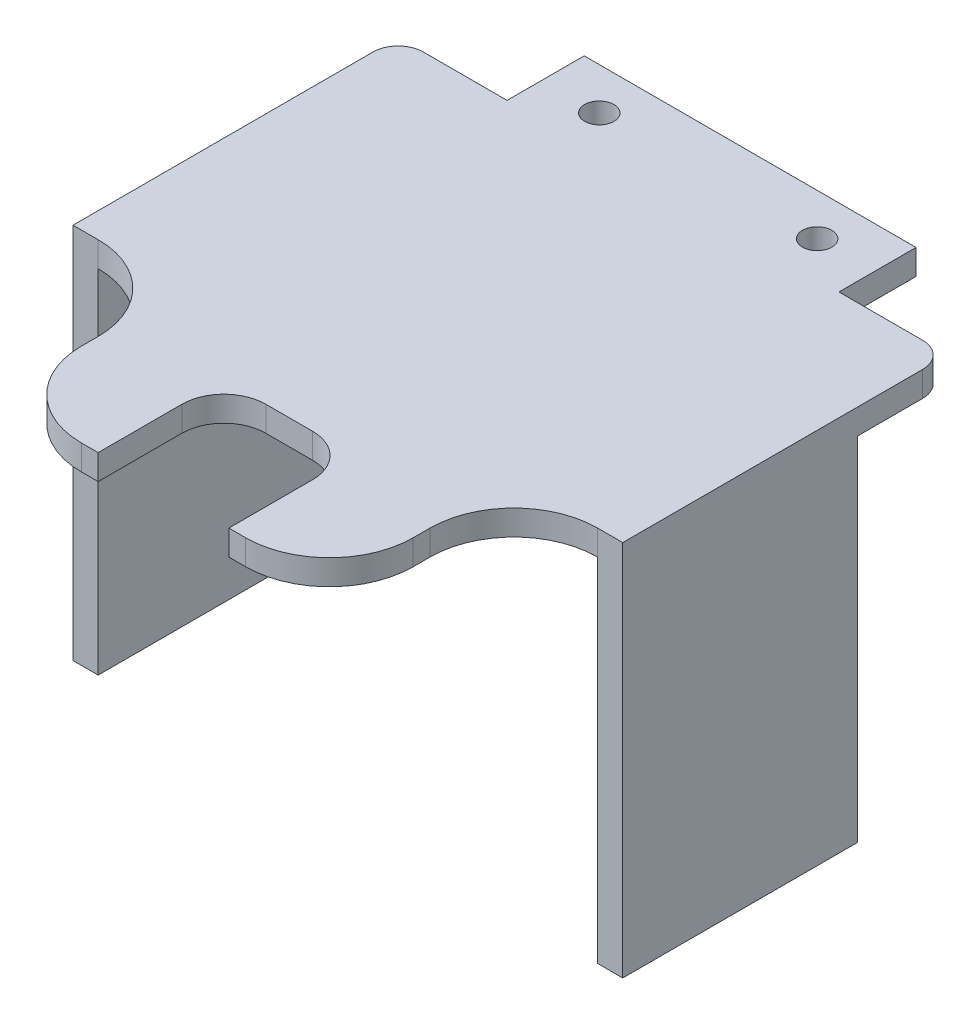
ISO-10303-21;
HEADER;
FILE_DESCRIPTION(('STEP AP214'),'2;1');
FILE_NAME('part.step','',(''),(''),'','','');
FILE_SCHEMA(('AUTOMOTIVE_DESIGN { 1 0 10303 214 1 1 1 1 }'));
ENDSEC;
DATA;
#1=APPLICATION_CONTEXT('core data for automotive mechanical design processes');
#2=APPLICATION_PROTOCOL_DEFINITION('international standard','automotive_design',2000,#1);
#3=PRODUCT_CONTEXT('',#1,'mechanical');
#4=PRODUCT('Part','Part','',(#3));
#5=PRODUCT_RELATED_PRODUCT_CATEGORY('part','',(#4));
#6=PRODUCT_DEFINITION_FORMATION('','',#4);
#7=PRODUCT_DEFINITION_CONTEXT('part definition',#1,'design');
#8=PRODUCT_DEFINITION('design','',#6,#7);
#9=PRODUCT_DEFINITION_SHAPE('','',#8);
#10=(LENGTH_UNIT() NAMED_UNIT(*) SI_UNIT(.MILLI.,.METRE.));
#11=(NAMED_UNIT(*) PLANE_ANGLE_UNIT() SI_UNIT($,.RADIAN.));
#12=(NAMED_UNIT(*) SI_UNIT($,.STERADIAN.) SOLID_ANGLE_UNIT());
#13=UNCERTAINTY_MEASURE_WITH_UNIT(LENGTH_MEASURE(1.E-05),#10,'distance_accuracy_value','');
#14=(GEOMETRIC_REPRESENTATION_CONTEXT(3) GLOBAL_UNCERTAINTY_ASSIGNED_CONTEXT((#13)) GLOBAL_UNIT_ASSIGNED_CONTEXT((#10,
#11,#12)) REPRESENTATION_CONTEXT('',''));
#15=CARTESIAN_POINT('',(0.,0.,0.));
#16=DIRECTION('',(0.,0.,1.));
#17=DIRECTION('',(1.,0.,0.));
#18=AXIS2_PLACEMENT_3D('',#15,#16,#17);
#19=CARTESIAN_POINT('',(0.,3.,0.));
#20=DIRECTION('',(0.,0.,-1.));
#21=DIRECTION('',(-1.,0.,0.));
#22=AXIS2_PLACEMENT_3D('',#19,#20,#21);
#23=PLANE('',#22);
#24=DIRECTION('',(1.,0.,0.));
#25=VECTOR('',#24,1.);
#26=CARTESIAN_POINT('',(0.,0.,0.));
#27=LINE('',#26,#25);
#28=CARTESIAN_POINT('',(10.,0.,0.));
#29=VERTEX_POINT('',#28);
#30=CARTESIAN_POINT('',(12.,0.,0.));
#31=VERTEX_POINT('',#30);
#32=EDGE_CURVE('E245',#29,#31,#27,.T.);
#33=ORIENTED_EDGE('',*,*,#32,.T.);
#34=DIRECTION('',(0.,1.,0.));
#35=VECTOR('',#34,1.);
#36=CARTESIAN_POINT('',(12.,-42.,0.));
#37=LINE('',#36,#35);
#38=CARTESIAN_POINT('',(12.,3.,0.));
#39=VERTEX_POINT('',#38);
#40=EDGE_CURVE('E232',#31,#39,#37,.T.);
#41=ORIENTED_EDGE('',*,*,#40,.T.);
#42=DIRECTION('',(1.,0.,0.));
#43=VECTOR('',#42,1.);
#44=CARTESIAN_POINT('',(0.,3.,0.));
#45=LINE('',#44,#43);
#46=CARTESIAN_POINT('',(10.,3.,0.));
#47=VERTEX_POINT('',#46);
#48=EDGE_CURVE('E242',#47,#39,#45,.T.);
#49=ORIENTED_EDGE('',*,*,#48,.F.);
#50=DIRECTION('',(0.,-1.,0.));
#51=VECTOR('',#50,1.);
#52=CARTESIAN_POINT('',(10.,3.,0.));
#53=LINE('',#52,#51);
#54=EDGE_CURVE('E310',#47,#29,#53,.T.);
#55=ORIENTED_EDGE('',*,*,#54,.T.);
#56=EDGE_LOOP('',(#33,#41,#49,#55));
#57=FACE_BOUND('',#56,.T.);
#58=ADVANCED_FACE('F39',(#57),#23,.F.);
#59=CARTESIAN_POINT('',(0.,0.,0.));
#60=DIRECTION('',(0.,-1.,0.));
#61=DIRECTION('',(0.,0.,-1.));
#62=AXIS2_PLACEMENT_3D('',#59,#60,#61);
#63=PLANE('',#62);
#64=DIRECTION('',(0.,0.,-1.));
#65=VECTOR('',#64,1.);
#66=CARTESIAN_POINT('',(12.,0.,0.));
#67=LINE('',#66,#65);
#68=CARTESIAN_POINT('',(12.,0.,-10.));
#69=VERTEX_POINT('',#68);
#70=EDGE_CURVE('E404',#31,#69,#67,.T.);
#71=ORIENTED_EDGE('',*,*,#70,.F.);
#72=ORIENTED_EDGE('',*,*,#32,.F.);
#73=CARTESIAN_POINT('',(10.,0.,-10.));
#74=DIRECTION('',(0.,-1.,0.));
#75=DIRECTION('',(0.,0.,-1.));
#76=AXIS2_PLACEMENT_3D('',#73,#74,#75);
#77=CIRCLE('',#76,10.);
#78=CARTESIAN_POINT('',(0.,0.,-10.));
#79=VERTEX_POINT('',#78);
#80=EDGE_CURVE('E305',#29,#79,#77,.T.);
#81=ORIENTED_EDGE('',*,*,#80,.T.);
#82=DIRECTION('',(0.,0.,1.));
#83=VECTOR('',#82,1.);
#84=CARTESIAN_POINT('',(0.,0.,0.));
#85=LINE('',#84,#83);
#86=CARTESIAN_POINT('',(0.,0.,-12.));
#87=VERTEX_POINT('',#86);
#88=EDGE_CURVE('E270',#87,#79,#85,.T.);
#89=ORIENTED_EDGE('',*,*,#88,.F.);
#90=CARTESIAN_POINT('',(-10.,0.,-12.));
#91=DIRECTION('',(0.,-1.,0.));
#92=DIRECTION('',(0.,0.,-1.));
#93=AXIS2_PLACEMENT_3D('',#90,#91,#92);
#94=CIRCLE('',#93,10.);
#95=CARTESIAN_POINT('',(-9.99999999999999,0.,-22.));
#96=VERTEX_POINT('',#95);
#97=EDGE_CURVE('E300',#87,#96,#94,.F.);
#98=ORIENTED_EDGE('',*,*,#97,.T.);
#99=DIRECTION('',(0.,0.,1.));
#100=VECTOR('',#99,1.);
#101=CARTESIAN_POINT('',(-9.99999999999999,0.,-22.));
#102=LINE('',#101,#100);
#103=CARTESIAN_POINT('',(-9.99999999999999,0.,-50.));
#104=VERTEX_POINT('',#103);
#105=EDGE_CURVE('E442',#104,#96,#102,.T.);
#106=ORIENTED_EDGE('',*,*,#105,.F.);
#107=DIRECTION('',(1.,0.,0.));
#108=VECTOR('',#107,1.);
#109=CARTESIAN_POINT('',(-13.,0.,-50.));
#110=LINE('',#109,#108);
#111=CARTESIAN_POINT('',(-13.,0.,-50.));
#112=VERTEX_POINT('',#111);
#113=EDGE_CURVE('E417',#112,#104,#110,.T.);
#114=ORIENTED_EDGE('',*,*,#113,.F.);
#115=DIRECTION('',(0.,0.,1.));
#116=VECTOR('',#115,1.);
#117=CARTESIAN_POINT('',(-13.,0.,-50.));
#118=LINE('',#117,#116);
#119=CARTESIAN_POINT('',(-13.,0.,-57.8));
#120=VERTEX_POINT('',#119);
#121=EDGE_CURVE('E414',#120,#112,#118,.T.);
#122=ORIENTED_EDGE('',*,*,#121,.F.);
#123=CARTESIAN_POINT('',(-10.,0.,-57.8));
#124=DIRECTION('',(0.,-1.,0.));
#125=DIRECTION('',(0.,0.,-1.));
#126=AXIS2_PLACEMENT_3D('',#123,#124,#125);
#127=CIRCLE('',#126,3.);
#128=CARTESIAN_POINT('',(-10.,0.,-60.8));
#129=VERTEX_POINT('',#128);
#130=EDGE_CURVE('E329',#120,#129,#127,.T.);
#131=ORIENTED_EDGE('',*,*,#130,.T.);
#132=DIRECTION('',(-1.,0.,0.));
#133=VECTOR('',#132,1.);
#134=CARTESIAN_POINT('',(-13.,0.,-60.8));
#135=LINE('',#134,#133);
#136=CARTESIAN_POINT('',(0.,0.,-60.8));
#137=VERTEX_POINT('',#136);
#138=EDGE_CURVE('E409',#137,#129,#135,.T.);
#139=ORIENTED_EDGE('',*,*,#138,.F.);
#140=CARTESIAN_POINT('',(0.,0.,-70.));
#141=VERTEX_POINT('',#140);
#142=EDGE_CURVE('E266',#141,#137,#85,.T.);
#143=ORIENTED_EDGE('',*,*,#142,.F.);
#144=DIRECTION('',(-1.,0.,0.));
#145=VECTOR('',#144,1.);
#146=CARTESIAN_POINT('',(0.,0.,-70.));
#147=LINE('',#146,#145);
#148=CARTESIAN_POINT('',(39.6,0.,-70.));
#149=VERTEX_POINT('',#148);
#150=EDGE_CURVE('E275',#149,#141,#147,.T.);
#151=ORIENTED_EDGE('',*,*,#150,.F.);
#152=DIRECTION('',(0.,0.,-1.));
#153=VECTOR('',#152,1.);
#154=CARTESIAN_POINT('',(39.6,0.,0.));
#155=LINE('',#154,#153);
#156=CARTESIAN_POINT('',(39.6,0.,-60.8));
#157=VERTEX_POINT('',#156);
#158=EDGE_CURVE('E272',#157,#149,#155,.T.);
#159=ORIENTED_EDGE('',*,*,#158,.F.);
#160=DIRECTION('',(-1.,0.,0.));
#161=VECTOR('',#160,1.);
#162=CARTESIAN_POINT('',(39.6,0.,-60.8));
#163=LINE('',#162,#161);
#164=CARTESIAN_POINT('',(49.6,0.,-60.8));
#165=VERTEX_POINT('',#164);
#166=EDGE_CURVE('E426',#165,#157,#163,.T.);
#167=ORIENTED_EDGE('',*,*,#166,.F.);
#168=CARTESIAN_POINT('',(49.6,0.,-57.8));
#169=DIRECTION('',(0.,-1.,0.));
#170=DIRECTION('',(0.,0.,-1.));
#171=AXIS2_PLACEMENT_3D('',#168,#169,#170);
#172=CIRCLE('',#171,3.);
#173=CARTESIAN_POINT('',(52.6,0.,-57.8));
#174=VERTEX_POINT('',#173);
#175=EDGE_CURVE('E331',#165,#174,#172,.T.);
#176=ORIENTED_EDGE('',*,*,#175,.T.);
#177=DIRECTION('',(0.,0.,-1.));
#178=VECTOR('',#177,1.);
#179=CARTESIAN_POINT('',(52.6,0.,-50.));
#180=LINE('',#179,#178);
#181=CARTESIAN_POINT('',(52.6,0.,-50.));
#182=VERTEX_POINT('',#181);
#183=EDGE_CURVE('E423',#182,#174,#180,.T.);
#184=ORIENTED_EDGE('',*,*,#183,.F.);
#185=DIRECTION('',(1.,0.,0.));
#186=VECTOR('',#185,1.);
#187=CARTESIAN_POINT('',(39.6,0.,-50.));
#188=LINE('',#187,#186);
#189=CARTESIAN_POINT('',(49.6,0.,-50.));
#190=VERTEX_POINT('',#189);
#191=EDGE_CURVE('E420',#190,#182,#188,.T.);
#192=ORIENTED_EDGE('',*,*,#191,.F.);
#193=DIRECTION('',(0.,0.,-1.));
#194=VECTOR('',#193,1.);
#195=CARTESIAN_POINT('',(49.6,0.,-22.));
#196=LINE('',#195,#194);
#197=CARTESIAN_POINT('',(49.6,0.,-22.));
#198=VERTEX_POINT('',#197);
#199=EDGE_CURVE('E439',#198,#190,#196,.T.);
#200=ORIENTED_EDGE('',*,*,#199,.F.);
#201=CARTESIAN_POINT('',(49.6,0.,-12.));
#202=DIRECTION('',(0.,-1.,0.));
#203=DIRECTION('',(0.,0.,-1.));
#204=AXIS2_PLACEMENT_3D('',#201,#202,#203);
#205=CIRCLE('',#204,10.);
#206=CARTESIAN_POINT('',(39.6,0.,-12.));
#207=VERTEX_POINT('',#206);
#208=EDGE_CURVE('E295',#198,#207,#205,.F.);
#209=ORIENTED_EDGE('',*,*,#208,.T.);
#210=CARTESIAN_POINT('',(39.6,0.,-10.));
#211=VERTEX_POINT('',#210);
#212=EDGE_CURVE('E273',#211,#207,#155,.T.);
#213=ORIENTED_EDGE('',*,*,#212,.F.);
#214=CARTESIAN_POINT('',(29.6,0.,-10.));
#215=DIRECTION('',(0.,-1.,0.));
#216=DIRECTION('',(0.,0.,-1.));
#217=AXIS2_PLACEMENT_3D('',#214,#215,#216);
#218=CIRCLE('',#217,10.);
#219=CARTESIAN_POINT('',(29.6,0.,0.));
#220=VERTEX_POINT('',#219);
#221=EDGE_CURVE('E307',#211,#220,#218,.T.);
#222=ORIENTED_EDGE('',*,*,#221,.T.);
#223=CARTESIAN_POINT('',(27.6,0.,0.));
#224=VERTEX_POINT('',#223);
#225=EDGE_CURVE('E269',#224,#220,#27,.T.);
#226=ORIENTED_EDGE('',*,*,#225,.F.);
#227=DIRECTION('',(0.,0.,1.));
#228=VECTOR('',#227,1.);
#229=CARTESIAN_POINT('',(27.6,0.,0.));
#230=LINE('',#229,#228);
#231=CARTESIAN_POINT('',(27.6,0.,-10.));
#232=VERTEX_POINT('',#231);
#233=EDGE_CURVE('E399',#232,#224,#230,.T.);
#234=ORIENTED_EDGE('',*,*,#233,.F.);
#235=CARTESIAN_POINT('',(22.6,0.,-10.));
#236=DIRECTION('',(0.,-1.,0.));
#237=DIRECTION('',(0.,0.,-1.));
#238=AXIS2_PLACEMENT_3D('',#235,#236,#237);
#239=CIRCLE('',#238,5.);
#240=CARTESIAN_POINT('',(22.6,0.,-15.));
#241=VERTEX_POINT('',#240);
#242=EDGE_CURVE('E348',#232,#241,#239,.F.);
#243=ORIENTED_EDGE('',*,*,#242,.T.);
#244=DIRECTION('',(1.,0.,0.));
#245=VECTOR('',#244,1.);
#246=CARTESIAN_POINT('',(0.,0.,-15.));
#247=LINE('',#246,#245);
#248=CARTESIAN_POINT('',(17.,0.,-15.));
#249=VERTEX_POINT('',#248);
#250=EDGE_CURVE('E402',#249,#241,#247,.T.);
#251=ORIENTED_EDGE('',*,*,#250,.F.);
#252=CARTESIAN_POINT('',(17.,0.,-10.));
#253=DIRECTION('',(0.,-1.,0.));
#254=DIRECTION('',(0.,0.,-1.));
#255=AXIS2_PLACEMENT_3D('',#252,#253,#254);
#256=CIRCLE('',#255,5.);
#257=EDGE_CURVE('E11',#249,#69,#256,.F.);
#258=ORIENTED_EDGE('',*,*,#257,.T.);
#259=EDGE_LOOP('',(#71,#72,#81,#89,#98,#106,#114,#122,#131,#139,#143,#151,#159,#167,#176,#184,
#192,#200,#209,#213,#222,#226,#234,#243,#251,#258));
#260=FACE_BOUND('',#259,.T.);
#261=CARTESIAN_POINT('',(6.8,0.,-65.));
#262=DIRECTION('',(0.,-1.,0.));
#263=DIRECTION('',(0.,0.,-1.));
#264=AXIS2_PLACEMENT_3D('',#261,#262,#263);
#265=CIRCLE('',#264,1.75000000000001);
#266=CARTESIAN_POINT('',(6.8,0.,-66.75));
#267=VERTEX_POINT('',#266);
#268=EDGE_CURVE('E495',#267,#267,#265,.T.);
#269=ORIENTED_EDGE('',*,*,#268,.F.);
#270=EDGE_LOOP('',(#269));
#271=FACE_BOUND('',#270,.T.);
#272=CARTESIAN_POINT('',(32.8,0.,-65.));
#273=DIRECTION('',(0.,-1.,0.));
#274=DIRECTION('',(0.,0.,-1.));
#275=AXIS2_PLACEMENT_3D('',#272,#273,#274);
#276=CIRCLE('',#275,1.75000000000002);
#277=CARTESIAN_POINT('',(32.8,0.,-66.75));
#278=VERTEX_POINT('',#277);
#279=EDGE_CURVE('E500',#278,#278,#276,.T.);
#280=ORIENTED_EDGE('',*,*,#279,.F.);
#281=EDGE_LOOP('',(#280));
#282=FACE_BOUND('',#281,.T.);
#283=ADVANCED_FACE('F364',(#260,#271,#282),#63,.T.);
#284=CARTESIAN_POINT('',(0.,3.,0.));
#285=DIRECTION('',(1.,0.,0.));
#286=DIRECTION('',(0.,0.,-1.));
#287=AXIS2_PLACEMENT_3D('',#284,#285,#286);
#288=PLANE('',#287);
#289=ORIENTED_EDGE('',*,*,#88,.T.);
#290=DIRECTION('',(0.,-1.,0.));
#291=VECTOR('',#290,1.);
#292=CARTESIAN_POINT('',(0.,3.,-10.));
#293=LINE('',#292,#291);
#294=CARTESIAN_POINT('',(0.,3.,-10.));
#295=VERTEX_POINT('',#294);
#296=EDGE_CURVE('E318',#79,#295,#293,.F.);
#297=ORIENTED_EDGE('',*,*,#296,.T.);
#298=DIRECTION('',(0.,0.,1.));
#299=VECTOR('',#298,1.);
#300=CARTESIAN_POINT('',(0.,3.,0.));
#301=LINE('',#300,#299);
#302=CARTESIAN_POINT('',(0.,3.,-12.));
#303=VERTEX_POINT('',#302);
#304=EDGE_CURVE('E277',#303,#295,#301,.T.);
#305=ORIENTED_EDGE('',*,*,#304,.F.);
#306=DIRECTION('',(0.,1.,0.));
#307=VECTOR('',#306,1.);
#308=CARTESIAN_POINT('',(0.,3.,-12.));
#309=LINE('',#308,#307);
#310=EDGE_CURVE('E291',#303,#87,#309,.F.);
#311=ORIENTED_EDGE('',*,*,#310,.T.);
#312=EDGE_LOOP('',(#289,#297,#305,#311));
#313=FACE_BOUND('',#312,.T.);
#314=ADVANCED_FACE('F372',(#313),#288,.F.);
#315=CARTESIAN_POINT('',(39.6,3.,0.));
#316=DIRECTION('',(-1.,0.,0.));
#317=DIRECTION('',(0.,0.,1.));
#318=AXIS2_PLACEMENT_3D('',#315,#316,#317);
#319=PLANE('',#318);
#320=DIRECTION('',(0.,0.,-1.));
#321=VECTOR('',#320,1.);
#322=CARTESIAN_POINT('',(39.6,3.,0.));
#323=LINE('',#322,#321);
#324=CARTESIAN_POINT('',(39.6,3.,-60.8));
#325=VERTEX_POINT('',#324);
#326=CARTESIAN_POINT('',(39.6,3.,-70.));
#327=VERTEX_POINT('',#326);
#328=EDGE_CURVE('E254',#325,#327,#323,.T.);
#329=ORIENTED_EDGE('',*,*,#328,.F.);
#330=DIRECTION('',(0.,1.,0.));
#331=VECTOR('',#330,1.);
#332=CARTESIAN_POINT('',(39.6,0.,-60.8));
#333=LINE('',#332,#331);
#334=EDGE_CURVE('E428',#157,#325,#333,.T.);
#335=ORIENTED_EDGE('',*,*,#334,.F.);
#336=ORIENTED_EDGE('',*,*,#158,.T.);
#337=DIRECTION('',(0.,-1.,0.));
#338=VECTOR('',#337,1.);
#339=CARTESIAN_POINT('',(39.6,3.,-70.));
#340=LINE('',#339,#338);
#341=EDGE_CURVE('E280',#327,#149,#340,.T.);
#342=ORIENTED_EDGE('',*,*,#341,.F.);
#343=EDGE_LOOP('',(#329,#335,#336,#342));
#344=FACE_BOUND('',#343,.T.);
#345=ADVANCED_FACE('F384',(#344),#319,.F.);
#346=ORIENTED_EDGE('',*,*,#142,.T.);
#347=DIRECTION('',(0.,1.,0.));
#348=VECTOR('',#347,1.);
#349=CARTESIAN_POINT('',(0.,0.,-60.8));
#350=LINE('',#349,#348);
#351=CARTESIAN_POINT('',(0.,3.,-60.8));
#352=VERTEX_POINT('',#351);
#353=EDGE_CURVE('E406',#137,#352,#350,.T.);
#354=ORIENTED_EDGE('',*,*,#353,.T.);
#355=CARTESIAN_POINT('',(0.,3.,-70.));
#356=VERTEX_POINT('',#355);
#357=EDGE_CURVE('E259',#356,#352,#301,.T.);
#358=ORIENTED_EDGE('',*,*,#357,.F.);
#359=DIRECTION('',(0.,-1.,0.));
#360=VECTOR('',#359,1.);
#361=CARTESIAN_POINT('',(0.,3.,-70.));
#362=LINE('',#361,#360);
#363=EDGE_CURVE('E265',#356,#141,#362,.T.);
#364=ORIENTED_EDGE('',*,*,#363,.T.);
#365=EDGE_LOOP('',(#346,#354,#358,#364));
#366=FACE_BOUND('',#365,.T.);
#367=ADVANCED_FACE('F377',(#366),#288,.F.);
#368=CARTESIAN_POINT('',(27.6,3.,0.));
#369=VERTEX_POINT('',#368);
#370=CARTESIAN_POINT('',(29.6,3.,0.));
#371=VERTEX_POINT('',#370);
#372=EDGE_CURVE('E255',#369,#371,#45,.T.);
#373=ORIENTED_EDGE('',*,*,#372,.F.);
#374=DIRECTION('',(0.,1.,0.));
#375=VECTOR('',#374,1.);
#376=CARTESIAN_POINT('',(27.6,-42.,0.));
#377=LINE('',#376,#375);
#378=EDGE_CURVE('E246',#224,#369,#377,.T.);
#379=ORIENTED_EDGE('',*,*,#378,.F.);
#380=ORIENTED_EDGE('',*,*,#225,.T.);
#381=DIRECTION('',(0.,-1.,0.));
#382=VECTOR('',#381,1.);
#383=CARTESIAN_POINT('',(29.6,3.,0.));
#384=LINE('',#383,#382);
#385=EDGE_CURVE('E312',#220,#371,#384,.F.);
#386=ORIENTED_EDGE('',*,*,#385,.T.);
#387=EDGE_LOOP('',(#373,#379,#380,#386));
#388=FACE_BOUND('',#387,.T.);
#389=ADVANCED_FACE('F366',(#388),#23,.F.);
#390=CARTESIAN_POINT('',(39.6,3.,-10.));
#391=VERTEX_POINT('',#390);
#392=CARTESIAN_POINT('',(39.6,3.,-12.));
#393=VERTEX_POINT('',#392);
#394=EDGE_CURVE('E257',#391,#393,#323,.T.);
#395=ORIENTED_EDGE('',*,*,#394,.F.);
#396=DIRECTION('',(0.,-1.,0.));
#397=VECTOR('',#396,1.);
#398=CARTESIAN_POINT('',(39.6,3.,-10.));
#399=LINE('',#398,#397);
#400=EDGE_CURVE('E302',#391,#211,#399,.T.);
#401=ORIENTED_EDGE('',*,*,#400,.T.);
#402=ORIENTED_EDGE('',*,*,#212,.T.);
#403=DIRECTION('',(0.,1.,0.));
#404=VECTOR('',#403,1.);
#405=CARTESIAN_POINT('',(39.6,3.,-12.));
#406=LINE('',#405,#404);
#407=EDGE_CURVE('E283',#207,#393,#406,.T.);
#408=ORIENTED_EDGE('',*,*,#407,.T.);
#409=EDGE_LOOP('',(#395,#401,#402,#408));
#410=FACE_BOUND('',#409,.T.);
#411=ADVANCED_FACE('F376',(#410),#319,.F.);
#412=CARTESIAN_POINT('',(0.,3.,-70.));
#413=DIRECTION('',(0.,0.,1.));
#414=DIRECTION('',(1.,0.,0.));
#415=AXIS2_PLACEMENT_3D('',#412,#413,#414);
#416=PLANE('',#415);
#417=ORIENTED_EDGE('',*,*,#150,.T.);
#418=ORIENTED_EDGE('',*,*,#363,.F.);
#419=DIRECTION('',(-1.,0.,0.));
#420=VECTOR('',#419,1.);
#421=CARTESIAN_POINT('',(0.,3.,-70.));
#422=LINE('',#421,#420);
#423=EDGE_CURVE('E263',#327,#356,#422,.T.);
#424=ORIENTED_EDGE('',*,*,#423,.F.);
#425=ORIENTED_EDGE('',*,*,#341,.T.);
#426=EDGE_LOOP('',(#417,#418,#424,#425));
#427=FACE_BOUND('',#426,.T.);
#428=ADVANCED_FACE('F382',(#427),#416,.F.);
#429=CARTESIAN_POINT('',(0.,3.,0.));
#430=DIRECTION('',(0.,-1.,0.));
#431=DIRECTION('',(0.,0.,-1.));
#432=AXIS2_PLACEMENT_3D('',#429,#430,#431);
#433=PLANE('',#432);
#434=ORIENTED_EDGE('',*,*,#48,.T.);
#435=DIRECTION('',(0.,0.,1.));
#436=VECTOR('',#435,1.);
#437=CARTESIAN_POINT('',(12.,3.,0.));
#438=LINE('',#437,#436);
#439=CARTESIAN_POINT('',(12.,3.,-10.));
#440=VERTEX_POINT('',#439);
#441=EDGE_CURVE('E229',#440,#39,#438,.T.);
#442=ORIENTED_EDGE('',*,*,#441,.F.);
#443=CARTESIAN_POINT('',(17.,3.,-10.));
#444=DIRECTION('',(0.,-1.,0.));
#445=DIRECTION('',(0.,0.,-1.));
#446=AXIS2_PLACEMENT_3D('',#443,#444,#445);
#447=CIRCLE('',#446,5.);
#448=CARTESIAN_POINT('',(17.,3.,-15.));
#449=VERTEX_POINT('',#448);
#450=EDGE_CURVE('E47',#440,#449,#447,.T.);
#451=ORIENTED_EDGE('',*,*,#450,.T.);
#452=DIRECTION('',(-1.,0.,0.));
#453=VECTOR('',#452,1.);
#454=CARTESIAN_POINT('',(12.,3.,-15.));
#455=LINE('',#454,#453);
#456=CARTESIAN_POINT('',(22.6,3.,-15.));
#457=VERTEX_POINT('',#456);
#458=EDGE_CURVE('E247',#457,#449,#455,.T.);
#459=ORIENTED_EDGE('',*,*,#458,.F.);
#460=CARTESIAN_POINT('',(22.6,3.,-10.));
#461=DIRECTION('',(0.,-1.,0.));
#462=DIRECTION('',(0.,0.,-1.));
#463=AXIS2_PLACEMENT_3D('',#460,#461,#462);
#464=CIRCLE('',#463,5.);
#465=CARTESIAN_POINT('',(27.6,3.,-10.));
#466=VERTEX_POINT('',#465);
#467=EDGE_CURVE('E346',#457,#466,#464,.T.);
#468=ORIENTED_EDGE('',*,*,#467,.T.);
#469=DIRECTION('',(0.,0.,-1.));
#470=VECTOR('',#469,1.);
#471=CARTESIAN_POINT('',(27.6,3.,0.));
#472=LINE('',#471,#470);
#473=EDGE_CURVE('E236',#369,#466,#472,.T.);
#474=ORIENTED_EDGE('',*,*,#473,.F.);
#475=ORIENTED_EDGE('',*,*,#372,.T.);
#476=CARTESIAN_POINT('',(29.6,3.,-10.));
#477=DIRECTION('',(0.,-1.,0.));
#478=DIRECTION('',(0.,0.,-1.));
#479=AXIS2_PLACEMENT_3D('',#476,#477,#478);
#480=CIRCLE('',#479,10.);
#481=EDGE_CURVE('E316',#371,#391,#480,.F.);
#482=ORIENTED_EDGE('',*,*,#481,.T.);
#483=ORIENTED_EDGE('',*,*,#394,.T.);
#484=CARTESIAN_POINT('',(49.6,3.,-12.));
#485=DIRECTION('',(0.,-1.,0.));
#486=DIRECTION('',(0.,0.,-1.));
#487=AXIS2_PLACEMENT_3D('',#484,#485,#486);
#488=CIRCLE('',#487,10.);
#489=CARTESIAN_POINT('',(49.6,3.,-22.));
#490=VERTEX_POINT('',#489);
#491=EDGE_CURVE('E293',#393,#490,#488,.T.);
#492=ORIENTED_EDGE('',*,*,#491,.T.);
#493=DIRECTION('',(1.,0.,0.));
#494=VECTOR('',#493,1.);
#495=CARTESIAN_POINT('',(39.6,3.,-22.));
#496=LINE('',#495,#494);
#497=CARTESIAN_POINT('',(52.6,3.,-22.));
#498=VERTEX_POINT('',#497);
#499=EDGE_CURVE('E481',#490,#498,#496,.T.);
#500=ORIENTED_EDGE('',*,*,#499,.T.);
#501=DIRECTION('',(0.,0.,-1.));
#502=VECTOR('',#501,1.);
#503=CARTESIAN_POINT('',(52.6,3.,-50.));
#504=LINE('',#503,#502);
#505=CARTESIAN_POINT('',(52.6,3.,-57.8));
#506=VERTEX_POINT('',#505);
#507=EDGE_CURVE('E483',#498,#506,#504,.T.);
#508=ORIENTED_EDGE('',*,*,#507,.T.);
#509=CARTESIAN_POINT('',(49.6,3.,-57.8));
#510=DIRECTION('',(0.,-1.,0.));
#511=DIRECTION('',(0.,0.,-1.));
#512=AXIS2_PLACEMENT_3D('',#509,#510,#511);
#513=CIRCLE('',#512,3.);
#514=CARTESIAN_POINT('',(49.6,3.,-60.8));
#515=VERTEX_POINT('',#514);
#516=EDGE_CURVE('E325',#506,#515,#513,.F.);
#517=ORIENTED_EDGE('',*,*,#516,.T.);
#518=DIRECTION('',(-1.,0.,0.));
#519=VECTOR('',#518,1.);
#520=CARTESIAN_POINT('',(39.6,3.,-60.8));
#521=LINE('',#520,#519);
#522=EDGE_CURVE('E413',#515,#325,#521,.T.);
#523=ORIENTED_EDGE('',*,*,#522,.T.);
#524=ORIENTED_EDGE('',*,*,#328,.T.);
#525=ORIENTED_EDGE('',*,*,#423,.T.);
#526=ORIENTED_EDGE('',*,*,#357,.T.);
#527=DIRECTION('',(-1.,0.,0.));
#528=VECTOR('',#527,1.);
#529=CARTESIAN_POINT('',(-13.,3.,-60.8));
#530=LINE('',#529,#528);
#531=CARTESIAN_POINT('',(-10.,3.,-60.8));
#532=VERTEX_POINT('',#531);
#533=EDGE_CURVE('E410',#352,#532,#530,.T.);
#534=ORIENTED_EDGE('',*,*,#533,.T.);
#535=CARTESIAN_POINT('',(-10.,3.,-57.8));
#536=DIRECTION('',(0.,-1.,0.));
#537=DIRECTION('',(0.,0.,-1.));
#538=AXIS2_PLACEMENT_3D('',#535,#536,#537);
#539=CIRCLE('',#538,3.);
#540=CARTESIAN_POINT('',(-13.,3.,-57.8));
#541=VERTEX_POINT('',#540);
#542=EDGE_CURVE('E323',#532,#541,#539,.F.);
#543=ORIENTED_EDGE('',*,*,#542,.T.);
#544=DIRECTION('',(0.,0.,1.));
#545=VECTOR('',#544,1.);
#546=CARTESIAN_POINT('',(-13.,3.,-50.));
#547=LINE('',#546,#545);
#548=CARTESIAN_POINT('',(-13.,3.,-22.));
#549=VERTEX_POINT('',#548);
#550=EDGE_CURVE('E479',#541,#549,#547,.T.);
#551=ORIENTED_EDGE('',*,*,#550,.T.);
#552=DIRECTION('',(1.,0.,0.));
#553=VECTOR('',#552,1.);
#554=CARTESIAN_POINT('',(0.,3.,-22.));
#555=LINE('',#554,#553);
#556=CARTESIAN_POINT('',(-10.,3.,-22.));
#557=VERTEX_POINT('',#556);
#558=EDGE_CURVE('E474',#549,#557,#555,.T.);
#559=ORIENTED_EDGE('',*,*,#558,.T.);
#560=CARTESIAN_POINT('',(-10.,3.,-12.));
#561=DIRECTION('',(0.,-1.,0.));
#562=DIRECTION('',(0.,0.,-1.));
#563=AXIS2_PLACEMENT_3D('',#560,#561,#562);
#564=CIRCLE('',#563,10.);
#565=EDGE_CURVE('E298',#557,#303,#564,.T.);
#566=ORIENTED_EDGE('',*,*,#565,.T.);
#567=ORIENTED_EDGE('',*,*,#304,.T.);
#568=CARTESIAN_POINT('',(10.,3.,-10.));
#569=DIRECTION('',(0.,-1.,0.));
#570=DIRECTION('',(0.,0.,-1.));
#571=AXIS2_PLACEMENT_3D('',#568,#569,#570);
#572=CIRCLE('',#571,10.);
#573=EDGE_CURVE('E253',#295,#47,#572,.F.);
#574=ORIENTED_EDGE('',*,*,#573,.T.);
#575=EDGE_LOOP('',(#434,#442,#451,#459,#468,#474,#475,#482,#483,#492,#500,#508,#517,#523,#524,
#525,#526,#534,#543,#551,#559,#566,#567,#574));
#576=FACE_BOUND('',#575,.T.);
#577=CARTESIAN_POINT('',(6.8,3.,-65.));
#578=DIRECTION('',(0.,1.,0.));
#579=DIRECTION('',(0.,0.,1.));
#580=AXIS2_PLACEMENT_3D('',#577,#578,#579);
#581=CIRCLE('',#580,1.75000000000001);
#582=CARTESIAN_POINT('',(6.8,3.,-63.25));
#583=VERTEX_POINT('',#582);
#584=EDGE_CURVE('E490',#583,#583,#581,.T.);
#585=ORIENTED_EDGE('',*,*,#584,.F.);
#586=EDGE_LOOP('',(#585));
#587=FACE_BOUND('',#586,.T.);
#588=CARTESIAN_POINT('',(32.8,3.,-65.));
#589=DIRECTION('',(0.,1.,0.));
#590=DIRECTION('',(0.,0.,1.));
#591=AXIS2_PLACEMENT_3D('',#588,#589,#590);
#592=CIRCLE('',#591,1.75000000000002);
#593=CARTESIAN_POINT('',(32.8,3.,-63.25));
#594=VERTEX_POINT('',#593);
#595=EDGE_CURVE('E498',#594,#594,#592,.T.);
#596=ORIENTED_EDGE('',*,*,#595,.F.);
#597=EDGE_LOOP('',(#596));
#598=FACE_BOUND('',#597,.T.);
#599=ADVANCED_FACE('F249',(#576,#587,#598),#433,.F.);
#600=CARTESIAN_POINT('',(32.8,3.,-65.));
#601=DIRECTION('',(0.,1.,0.));
#602=DIRECTION('',(0.,0.,1.));
#603=AXIS2_PLACEMENT_3D('',#600,#601,#602);
#604=CYLINDRICAL_SURFACE('',#603,1.75000000000002);
#605=ORIENTED_EDGE('',*,*,#595,.T.);
#606=EDGE_LOOP('',(#605));
#607=FACE_BOUND('',#606,.T.);
#608=ORIENTED_EDGE('',*,*,#279,.T.);
#609=EDGE_LOOP('',(#608));
#610=FACE_BOUND('',#609,.T.);
#611=ADVANCED_FACE('F520',(#607,#610),#604,.F.);
#612=CARTESIAN_POINT('',(6.8,3.,-65.));
#613=DIRECTION('',(0.,1.,0.));
#614=DIRECTION('',(0.,0.,1.));
#615=AXIS2_PLACEMENT_3D('',#612,#613,#614);
#616=CYLINDRICAL_SURFACE('',#615,1.75000000000001);
#617=ORIENTED_EDGE('',*,*,#584,.T.);
#618=EDGE_LOOP('',(#617));
#619=FACE_BOUND('',#618,.T.);
#620=ORIENTED_EDGE('',*,*,#268,.T.);
#621=EDGE_LOOP('',(#620));
#622=FACE_BOUND('',#621,.T.);
#623=ADVANCED_FACE('F517',(#619,#622),#616,.F.);
#624=CARTESIAN_POINT('',(39.6,0.,-50.));
#625=DIRECTION('',(0.,0.,-1.));
#626=DIRECTION('',(-1.,0.,0.));
#627=AXIS2_PLACEMENT_3D('',#624,#625,#626);
#628=PLANE('',#627);
#629=ORIENTED_EDGE('',*,*,#191,.T.);
#630=DIRECTION('',(0.,1.,0.));
#631=VECTOR('',#630,1.);
#632=CARTESIAN_POINT('',(52.6,0.,-50.));
#633=LINE('',#632,#631);
#634=CARTESIAN_POINT('',(52.6,-42.,-50.));
#635=VERTEX_POINT('',#634);
#636=EDGE_CURVE('E487',#635,#182,#633,.T.);
#637=ORIENTED_EDGE('',*,*,#636,.F.);
#638=DIRECTION('',(1.,0.,0.));
#639=VECTOR('',#638,1.);
#640=CARTESIAN_POINT('',(52.6,-42.,-50.));
#641=LINE('',#640,#639);
#642=CARTESIAN_POINT('',(49.6,-42.,-50.));
#643=VERTEX_POINT('',#642);
#644=EDGE_CURVE('E438',#643,#635,#641,.T.);
#645=ORIENTED_EDGE('',*,*,#644,.F.);
#646=DIRECTION('',(0.,1.,0.));
#647=VECTOR('',#646,1.);
#648=CARTESIAN_POINT('',(49.6,-42.,-50.));
#649=LINE('',#648,#647);
#650=EDGE_CURVE('E435',#643,#190,#649,.T.);
#651=ORIENTED_EDGE('',*,*,#650,.T.);
#652=EDGE_LOOP('',(#629,#637,#645,#651));
#653=FACE_BOUND('',#652,.T.);
#654=ADVANCED_FACE('F519',(#653),#628,.T.);
#655=CARTESIAN_POINT('',(52.6,0.,-50.));
#656=DIRECTION('',(1.,0.,0.));
#657=DIRECTION('',(0.,0.,-1.));
#658=AXIS2_PLACEMENT_3D('',#655,#656,#657);
#659=PLANE('',#658);
#660=ORIENTED_EDGE('',*,*,#183,.T.);
#661=DIRECTION('',(0.,1.,0.));
#662=VECTOR('',#661,1.);
#663=CARTESIAN_POINT('',(52.6,0.,-57.8));
#664=LINE('',#663,#662);
#665=EDGE_CURVE('E320',#174,#506,#664,.T.);
#666=ORIENTED_EDGE('',*,*,#665,.T.);
#667=ORIENTED_EDGE('',*,*,#507,.F.);
#668=DIRECTION('',(0.,1.,0.));
#669=VECTOR('',#668,1.);
#670=CARTESIAN_POINT('',(52.6,0.,-22.));
#671=LINE('',#670,#669);
#672=CARTESIAN_POINT('',(52.6,-42.,-22.));
#673=VERTEX_POINT('',#672);
#674=EDGE_CURVE('E486',#673,#498,#671,.T.);
#675=ORIENTED_EDGE('',*,*,#674,.F.);
#676=DIRECTION('',(0.,0.,1.));
#677=VECTOR('',#676,1.);
#678=CARTESIAN_POINT('',(52.6,-42.,-22.));
#679=LINE('',#678,#677);
#680=EDGE_CURVE('E443',#635,#673,#679,.T.);
#681=ORIENTED_EDGE('',*,*,#680,.F.);
#682=ORIENTED_EDGE('',*,*,#636,.T.);
#683=EDGE_LOOP('',(#660,#666,#667,#675,#681,#682));
#684=FACE_BOUND('',#683,.T.);
#685=ADVANCED_FACE('F528',(#684),#659,.T.);
#686=CARTESIAN_POINT('',(39.6,0.,-22.));
#687=DIRECTION('',(0.,0.,1.));
#688=DIRECTION('',(1.,0.,0.));
#689=AXIS2_PLACEMENT_3D('',#686,#687,#688);
#690=PLANE('',#689);
#691=ORIENTED_EDGE('',*,*,#499,.F.);
#692=DIRECTION('',(0.,1.,0.));
#693=VECTOR('',#692,1.);
#694=CARTESIAN_POINT('',(49.6,0.,-22.));
#695=LINE('',#694,#693);
#696=EDGE_CURVE('E286',#490,#198,#695,.F.);
#697=ORIENTED_EDGE('',*,*,#696,.T.);
#698=DIRECTION('',(0.,1.,0.));
#699=VECTOR('',#698,1.);
#700=CARTESIAN_POINT('',(49.6,-42.,-22.));
#701=LINE('',#700,#699);
#702=CARTESIAN_POINT('',(49.6,-42.,-22.));
#703=VERTEX_POINT('',#702);
#704=EDGE_CURVE('E432',#703,#198,#701,.T.);
#705=ORIENTED_EDGE('',*,*,#704,.F.);
#706=DIRECTION('',(-1.,0.,0.));
#707=VECTOR('',#706,1.);
#708=CARTESIAN_POINT('',(52.6,-42.,-22.));
#709=LINE('',#708,#707);
#710=EDGE_CURVE('E448',#673,#703,#709,.T.);
#711=ORIENTED_EDGE('',*,*,#710,.F.);
#712=ORIENTED_EDGE('',*,*,#674,.T.);
#713=EDGE_LOOP('',(#691,#697,#705,#711,#712));
#714=FACE_BOUND('',#713,.T.);
#715=ADVANCED_FACE('F534',(#714),#690,.T.);
#716=CARTESIAN_POINT('',(0.,0.,-22.));
#717=DIRECTION('',(0.,0.,1.));
#718=DIRECTION('',(1.,0.,0.));
#719=AXIS2_PLACEMENT_3D('',#716,#717,#718);
#720=PLANE('',#719);
#721=DIRECTION('',(0.,1.,0.));
#722=VECTOR('',#721,1.);
#723=CARTESIAN_POINT('',(-9.99999999999999,-42.,-22.));
#724=LINE('',#723,#722);
#725=CARTESIAN_POINT('',(-9.99999999999999,-42.,-22.));
#726=VERTEX_POINT('',#725);
#727=EDGE_CURVE('E462',#726,#96,#724,.T.);
#728=ORIENTED_EDGE('',*,*,#727,.T.);
#729=DIRECTION('',(0.,1.,0.));
#730=VECTOR('',#729,1.);
#731=CARTESIAN_POINT('',(-10.,0.,-22.));
#732=LINE('',#731,#730);
#733=EDGE_CURVE('E288',#96,#557,#732,.T.);
#734=ORIENTED_EDGE('',*,*,#733,.T.);
#735=ORIENTED_EDGE('',*,*,#558,.F.);
#736=DIRECTION('',(0.,1.,0.));
#737=VECTOR('',#736,1.);
#738=CARTESIAN_POINT('',(-13.,0.,-22.));
#739=LINE('',#738,#737);
#740=CARTESIAN_POINT('',(-13.,-42.,-22.));
#741=VERTEX_POINT('',#740);
#742=EDGE_CURVE('E470',#741,#549,#739,.T.);
#743=ORIENTED_EDGE('',*,*,#742,.F.);
#744=DIRECTION('',(-1.,0.,0.));
#745=VECTOR('',#744,1.);
#746=CARTESIAN_POINT('',(-13.,-42.,-22.));
#747=LINE('',#746,#745);
#748=EDGE_CURVE('E459',#726,#741,#747,.T.);
#749=ORIENTED_EDGE('',*,*,#748,.F.);
#750=EDGE_LOOP('',(#728,#734,#735,#743,#749));
#751=FACE_BOUND('',#750,.T.);
#752=ADVANCED_FACE('F567',(#751),#720,.T.);
#753=CARTESIAN_POINT('',(-13.,0.,-50.));
#754=DIRECTION('',(-1.,0.,0.));
#755=DIRECTION('',(0.,0.,1.));
#756=AXIS2_PLACEMENT_3D('',#753,#754,#755);
#757=PLANE('',#756);
#758=ORIENTED_EDGE('',*,*,#550,.F.);
#759=DIRECTION('',(0.,1.,0.));
#760=VECTOR('',#759,1.);
#761=CARTESIAN_POINT('',(-13.,0.,-57.8));
#762=LINE('',#761,#760);
#763=EDGE_CURVE('E336',#541,#120,#762,.F.);
#764=ORIENTED_EDGE('',*,*,#763,.T.);
#765=ORIENTED_EDGE('',*,*,#121,.T.);
#766=DIRECTION('',(0.,1.,0.));
#767=VECTOR('',#766,1.);
#768=CARTESIAN_POINT('',(-13.,0.,-50.));
#769=LINE('',#768,#767);
#770=CARTESIAN_POINT('',(-13.,-42.,-50.));
#771=VERTEX_POINT('',#770);
#772=EDGE_CURVE('E471',#771,#112,#769,.T.);
#773=ORIENTED_EDGE('',*,*,#772,.F.);
#774=DIRECTION('',(0.,0.,-1.));
#775=VECTOR('',#774,1.);
#776=CARTESIAN_POINT('',(-13.,-42.,-22.));
#777=LINE('',#776,#775);
#778=EDGE_CURVE('E452',#741,#771,#777,.T.);
#779=ORIENTED_EDGE('',*,*,#778,.F.);
#780=ORIENTED_EDGE('',*,*,#742,.T.);
#781=EDGE_LOOP('',(#758,#764,#765,#773,#779,#780));
#782=FACE_BOUND('',#781,.T.);
#783=ADVANCED_FACE('F562',(#782),#757,.T.);
#784=CARTESIAN_POINT('',(0.,0.,-50.));
#785=DIRECTION('',(0.,0.,-1.));
#786=DIRECTION('',(-1.,0.,0.));
#787=AXIS2_PLACEMENT_3D('',#784,#785,#786);
#788=PLANE('',#787);
#789=ORIENTED_EDGE('',*,*,#113,.T.);
#790=DIRECTION('',(0.,1.,0.));
#791=VECTOR('',#790,1.);
#792=CARTESIAN_POINT('',(-9.99999999999999,-42.,-50.));
#793=LINE('',#792,#791);
#794=CARTESIAN_POINT('',(-9.99999999999999,-42.,-50.));
#795=VERTEX_POINT('',#794);
#796=EDGE_CURVE('E467',#795,#104,#793,.T.);
#797=ORIENTED_EDGE('',*,*,#796,.F.);
#798=DIRECTION('',(1.,0.,0.));
#799=VECTOR('',#798,1.);
#800=CARTESIAN_POINT('',(-13.,-42.,-50.));
#801=LINE('',#800,#799);
#802=EDGE_CURVE('E455',#771,#795,#801,.T.);
#803=ORIENTED_EDGE('',*,*,#802,.F.);
#804=ORIENTED_EDGE('',*,*,#772,.T.);
#805=EDGE_LOOP('',(#789,#797,#803,#804));
#806=FACE_BOUND('',#805,.T.);
#807=ADVANCED_FACE('F582',(#806),#788,.T.);
#808=CARTESIAN_POINT('',(-9.99999999999999,-42.,-22.));
#809=DIRECTION('',(-1.,0.,0.));
#810=DIRECTION('',(0.,0.,1.));
#811=AXIS2_PLACEMENT_3D('',#808,#809,#810);
#812=PLANE('',#811);
#813=ORIENTED_EDGE('',*,*,#105,.T.);
#814=ORIENTED_EDGE('',*,*,#727,.F.);
#815=DIRECTION('',(0.,0.,1.));
#816=VECTOR('',#815,1.);
#817=CARTESIAN_POINT('',(-9.99999999999999,-42.,-22.));
#818=LINE('',#817,#816);
#819=EDGE_CURVE('E457',#795,#726,#818,.T.);
#820=ORIENTED_EDGE('',*,*,#819,.F.);
#821=ORIENTED_EDGE('',*,*,#796,.T.);
#822=EDGE_LOOP('',(#813,#814,#820,#821));
#823=FACE_BOUND('',#822,.T.);
#824=ADVANCED_FACE('F575',(#823),#812,.F.);
#825=CARTESIAN_POINT('',(0.,-42.,0.));
#826=DIRECTION('',(0.,-1.,0.));
#827=DIRECTION('',(0.,0.,-1.));
#828=AXIS2_PLACEMENT_3D('',#825,#826,#827);
#829=PLANE('',#828);
#830=ORIENTED_EDGE('',*,*,#778,.T.);
#831=ORIENTED_EDGE('',*,*,#802,.T.);
#832=ORIENTED_EDGE('',*,*,#819,.T.);
#833=ORIENTED_EDGE('',*,*,#748,.T.);
#834=EDGE_LOOP('',(#830,#831,#832,#833));
#835=FACE_BOUND('',#834,.T.);
#836=ADVANCED_FACE('F579',(#835),#829,.T.);
#837=CARTESIAN_POINT('',(49.6,-42.,-22.));
#838=DIRECTION('',(1.,0.,0.));
#839=DIRECTION('',(0.,0.,-1.));
#840=AXIS2_PLACEMENT_3D('',#837,#838,#839);
#841=PLANE('',#840);
#842=ORIENTED_EDGE('',*,*,#199,.T.);
#843=ORIENTED_EDGE('',*,*,#650,.F.);
#844=DIRECTION('',(0.,0.,-1.));
#845=VECTOR('',#844,1.);
#846=CARTESIAN_POINT('',(49.6,-42.,-22.));
#847=LINE('',#846,#845);
#848=EDGE_CURVE('E446',#703,#643,#847,.T.);
#849=ORIENTED_EDGE('',*,*,#848,.F.);
#850=ORIENTED_EDGE('',*,*,#704,.T.);
#851=EDGE_LOOP('',(#842,#843,#849,#850));
#852=FACE_BOUND('',#851,.T.);
#853=ADVANCED_FACE('F651',(#852),#841,.F.);
#854=CARTESIAN_POINT('',(0.,-42.,0.));
#855=DIRECTION('',(0.,1.,0.));
#856=DIRECTION('',(0.,0.,1.));
#857=AXIS2_PLACEMENT_3D('',#854,#855,#856);
#858=PLANE('',#857);
#859=ORIENTED_EDGE('',*,*,#680,.T.);
#860=ORIENTED_EDGE('',*,*,#710,.T.);
#861=ORIENTED_EDGE('',*,*,#848,.T.);
#862=ORIENTED_EDGE('',*,*,#644,.T.);
#863=EDGE_LOOP('',(#859,#860,#861,#862));
#864=FACE_BOUND('',#863,.T.);
#865=ADVANCED_FACE('F627',(#864),#858,.F.);
#866=CARTESIAN_POINT('',(49.6,3.,-12.));
#867=DIRECTION('',(0.,1.,0.));
#868=DIRECTION('',(0.,0.,1.));
#869=AXIS2_PLACEMENT_3D('',#866,#867,#868);
#870=CYLINDRICAL_SURFACE('',#869,10.);
#871=ORIENTED_EDGE('',*,*,#208,.F.);
#872=ORIENTED_EDGE('',*,*,#696,.F.);
#873=ORIENTED_EDGE('',*,*,#491,.F.);
#874=ORIENTED_EDGE('',*,*,#407,.F.);
#875=EDGE_LOOP('',(#871,#872,#873,#874));
#876=FACE_BOUND('',#875,.T.);
#877=ADVANCED_FACE('F624',(#876),#870,.F.);
#878=CARTESIAN_POINT('',(-10.,0.,-12.));
#879=DIRECTION('',(0.,1.,0.));
#880=DIRECTION('',(0.,0.,1.));
#881=AXIS2_PLACEMENT_3D('',#878,#879,#880);
#882=CYLINDRICAL_SURFACE('',#881,10.);
#883=ORIENTED_EDGE('',*,*,#97,.F.);
#884=ORIENTED_EDGE('',*,*,#310,.F.);
#885=ORIENTED_EDGE('',*,*,#565,.F.);
#886=ORIENTED_EDGE('',*,*,#733,.F.);
#887=EDGE_LOOP('',(#883,#884,#885,#886));
#888=FACE_BOUND('',#887,.T.);
#889=ADVANCED_FACE('F570',(#888),#882,.F.);
#890=CARTESIAN_POINT('',(29.6,3.,-10.));
#891=DIRECTION('',(0.,-1.,0.));
#892=DIRECTION('',(0.,0.,-1.));
#893=AXIS2_PLACEMENT_3D('',#890,#891,#892);
#894=CYLINDRICAL_SURFACE('',#893,10.);
#895=ORIENTED_EDGE('',*,*,#481,.F.);
#896=ORIENTED_EDGE('',*,*,#385,.F.);
#897=ORIENTED_EDGE('',*,*,#221,.F.);
#898=ORIENTED_EDGE('',*,*,#400,.F.);
#899=EDGE_LOOP('',(#895,#896,#897,#898));
#900=FACE_BOUND('',#899,.T.);
#901=ADVANCED_FACE('F630',(#900),#894,.T.);
#902=CARTESIAN_POINT('',(10.,3.,-10.));
#903=DIRECTION('',(0.,-1.,0.));
#904=DIRECTION('',(0.,0.,-1.));
#905=AXIS2_PLACEMENT_3D('',#902,#903,#904);
#906=CYLINDRICAL_SURFACE('',#905,10.);
#907=ORIENTED_EDGE('',*,*,#573,.F.);
#908=ORIENTED_EDGE('',*,*,#296,.F.);
#909=ORIENTED_EDGE('',*,*,#80,.F.);
#910=ORIENTED_EDGE('',*,*,#54,.F.);
#911=EDGE_LOOP('',(#907,#908,#909,#910));
#912=FACE_BOUND('',#911,.T.);
#913=ADVANCED_FACE('F512',(#912),#906,.T.);
#914=CARTESIAN_POINT('',(39.6,0.,-60.8));
#915=DIRECTION('',(0.,0.,-1.));
#916=DIRECTION('',(-1.,0.,0.));
#917=AXIS2_PLACEMENT_3D('',#914,#915,#916);
#918=PLANE('',#917);
#919=ORIENTED_EDGE('',*,*,#522,.F.);
#920=DIRECTION('',(0.,1.,0.));
#921=VECTOR('',#920,1.);
#922=CARTESIAN_POINT('',(49.6,0.,-60.8));
#923=LINE('',#922,#921);
#924=EDGE_CURVE('E327',#515,#165,#923,.F.);
#925=ORIENTED_EDGE('',*,*,#924,.T.);
#926=ORIENTED_EDGE('',*,*,#166,.T.);
#927=ORIENTED_EDGE('',*,*,#334,.T.);
#928=EDGE_LOOP('',(#919,#925,#926,#927));
#929=FACE_BOUND('',#928,.T.);
#930=ADVANCED_FACE('F610',(#929),#918,.T.);
#931=CARTESIAN_POINT('',(-13.,0.,-60.8));
#932=DIRECTION('',(0.,0.,-1.));
#933=DIRECTION('',(-1.,0.,0.));
#934=AXIS2_PLACEMENT_3D('',#931,#932,#933);
#935=PLANE('',#934);
#936=ORIENTED_EDGE('',*,*,#138,.T.);
#937=DIRECTION('',(0.,1.,0.));
#938=VECTOR('',#937,1.);
#939=CARTESIAN_POINT('',(-10.,0.,-60.8));
#940=LINE('',#939,#938);
#941=EDGE_CURVE('E333',#129,#532,#940,.T.);
#942=ORIENTED_EDGE('',*,*,#941,.T.);
#943=ORIENTED_EDGE('',*,*,#533,.F.);
#944=ORIENTED_EDGE('',*,*,#353,.F.);
#945=EDGE_LOOP('',(#936,#942,#943,#944));
#946=FACE_BOUND('',#945,.T.);
#947=ADVANCED_FACE('F556',(#946),#935,.T.);
#948=CARTESIAN_POINT('',(49.6,0.,-57.8));
#949=DIRECTION('',(0.,1.,0.));
#950=DIRECTION('',(0.,0.,1.));
#951=AXIS2_PLACEMENT_3D('',#948,#949,#950);
#952=CYLINDRICAL_SURFACE('',#951,3.);
#953=ORIENTED_EDGE('',*,*,#175,.F.);
#954=ORIENTED_EDGE('',*,*,#924,.F.);
#955=ORIENTED_EDGE('',*,*,#516,.F.);
#956=ORIENTED_EDGE('',*,*,#665,.F.);
#957=EDGE_LOOP('',(#953,#954,#955,#956));
#958=FACE_BOUND('',#957,.T.);
#959=ADVANCED_FACE('F606',(#958),#952,.T.);
#960=CARTESIAN_POINT('',(-10.,0.,-57.8));
#961=DIRECTION('',(0.,1.,0.));
#962=DIRECTION('',(0.,0.,1.));
#963=AXIS2_PLACEMENT_3D('',#960,#961,#962);
#964=CYLINDRICAL_SURFACE('',#963,3.);
#965=ORIENTED_EDGE('',*,*,#130,.F.);
#966=ORIENTED_EDGE('',*,*,#763,.F.);
#967=ORIENTED_EDGE('',*,*,#542,.F.);
#968=ORIENTED_EDGE('',*,*,#941,.F.);
#969=EDGE_LOOP('',(#965,#966,#967,#968));
#970=FACE_BOUND('',#969,.T.);
#971=ADVANCED_FACE('F558',(#970),#964,.T.);
#972=CARTESIAN_POINT('',(12.,-42.,0.));
#973=DIRECTION('',(-1.,0.,0.));
#974=DIRECTION('',(0.,0.,1.));
#975=AXIS2_PLACEMENT_3D('',#972,#973,#974);
#976=PLANE('',#975);
#977=ORIENTED_EDGE('',*,*,#70,.T.);
#978=DIRECTION('',(0.,1.,0.));
#979=VECTOR('',#978,1.);
#980=CARTESIAN_POINT('',(12.,3.,-10.));
#981=LINE('',#980,#979);
#982=EDGE_CURVE('E233',#69,#440,#981,.T.);
#983=ORIENTED_EDGE('',*,*,#982,.T.);
#984=ORIENTED_EDGE('',*,*,#441,.T.);
#985=ORIENTED_EDGE('',*,*,#40,.F.);
#986=EDGE_LOOP('',(#977,#983,#984,#985));
#987=FACE_BOUND('',#986,.T.);
#988=ADVANCED_FACE('F231',(#987),#976,.F.);
#989=CARTESIAN_POINT('',(12.,-42.,-15.));
#990=DIRECTION('',(0.,0.,-1.));
#991=DIRECTION('',(-1.,0.,0.));
#992=AXIS2_PLACEMENT_3D('',#989,#990,#991);
#993=PLANE('',#992);
#994=ORIENTED_EDGE('',*,*,#250,.T.);
#995=DIRECTION('',(0.,1.,0.));
#996=VECTOR('',#995,1.);
#997=CARTESIAN_POINT('',(22.6,3.,-15.));
#998=LINE('',#997,#996);
#999=EDGE_CURVE('E340',#241,#457,#998,.T.);
#1000=ORIENTED_EDGE('',*,*,#999,.T.);
#1001=ORIENTED_EDGE('',*,*,#458,.T.);
#1002=DIRECTION('',(0.,1.,0.));
#1003=VECTOR('',#1002,1.);
#1004=CARTESIAN_POINT('',(17.,0.,-15.));
#1005=LINE('',#1004,#1003);
#1006=EDGE_CURVE('E338',#449,#249,#1005,.F.);
#1007=ORIENTED_EDGE('',*,*,#1006,.T.);
#1008=EDGE_LOOP('',(#994,#1000,#1001,#1007));
#1009=FACE_BOUND('',#1008,.T.);
#1010=ADVANCED_FACE('F353',(#1009),#993,.F.);
#1011=CARTESIAN_POINT('',(27.6,-42.,0.));
#1012=DIRECTION('',(1.,0.,0.));
#1013=DIRECTION('',(0.,0.,-1.));
#1014=AXIS2_PLACEMENT_3D('',#1011,#1012,#1013);
#1015=PLANE('',#1014);
#1016=ORIENTED_EDGE('',*,*,#473,.T.);
#1017=DIRECTION('',(0.,1.,0.));
#1018=VECTOR('',#1017,1.);
#1019=CARTESIAN_POINT('',(27.6,0.,-10.));
#1020=LINE('',#1019,#1018);
#1021=EDGE_CURVE('E343',#466,#232,#1020,.F.);
#1022=ORIENTED_EDGE('',*,*,#1021,.T.);
#1023=ORIENTED_EDGE('',*,*,#233,.T.);
#1024=ORIENTED_EDGE('',*,*,#378,.T.);
#1025=EDGE_LOOP('',(#1016,#1022,#1023,#1024));
#1026=FACE_BOUND('',#1025,.T.);
#1027=ADVANCED_FACE('F361',(#1026),#1015,.F.);
#1028=CARTESIAN_POINT('',(22.6,-42.,-10.));
#1029=DIRECTION('',(0.,-1.,0.));
#1030=DIRECTION('',(0.,0.,-1.));
#1031=AXIS2_PLACEMENT_3D('',#1028,#1029,#1030);
#1032=CYLINDRICAL_SURFACE('',#1031,5.);
#1033=ORIENTED_EDGE('',*,*,#242,.F.);
#1034=ORIENTED_EDGE('',*,*,#1021,.F.);
#1035=ORIENTED_EDGE('',*,*,#467,.F.);
#1036=ORIENTED_EDGE('',*,*,#999,.F.);
#1037=EDGE_LOOP('',(#1033,#1034,#1035,#1036));
#1038=FACE_BOUND('',#1037,.T.);
#1039=ADVANCED_FACE('F357',(#1038),#1032,.F.);
#1040=CARTESIAN_POINT('',(17.,-42.,-10.));
#1041=DIRECTION('',(0.,-1.,0.));
#1042=DIRECTION('',(0.,0.,-1.));
#1043=AXIS2_PLACEMENT_3D('',#1040,#1041,#1042);
#1044=CYLINDRICAL_SURFACE('',#1043,5.);
#1045=ORIENTED_EDGE('',*,*,#257,.F.);
#1046=ORIENTED_EDGE('',*,*,#1006,.F.);
#1047=ORIENTED_EDGE('',*,*,#450,.F.);
#1048=ORIENTED_EDGE('',*,*,#982,.F.);
#1049=EDGE_LOOP('',(#1045,#1046,#1047,#1048));
#1050=FACE_BOUND('',#1049,.T.);
#1051=ADVANCED_FACE('F41',(#1050),#1044,.F.);
#1052=CLOSED_SHELL('',(#58,#283,#314,#345,#367,#389,#411,#428,#599,#611,#623,#654,#685,#715,
#752,#783,#807,#824,#836,#853,#865,#877,#889,#901,#913,#930,#947,#959,#971,#988,#1010,#1027,
#1039,#1051));
#1053=MANIFOLD_SOLID_BREP('B2',#1052);
#1054=ADVANCED_BREP_SHAPE_REPRESENTATION('',(#18,#1053),#14);
#1055=SHAPE_DEFINITION_REPRESENTATION(#9,#1054);
ENDSEC;
END-ISO-10303-21;
